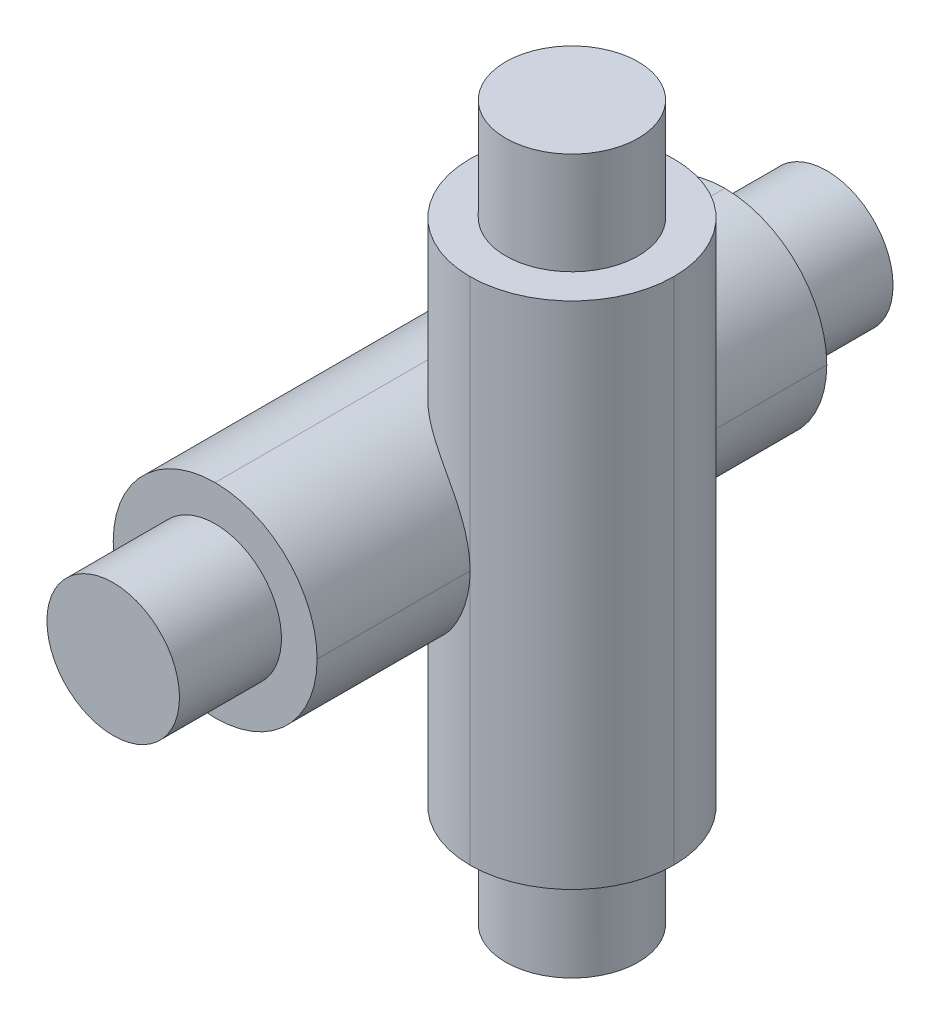
ISO-10303-21;
HEADER;
FILE_DESCRIPTION(('STEP AP214'),'2;1');
FILE_NAME('part.step','',(''),(''),'','','');
FILE_SCHEMA(('AUTOMOTIVE_DESIGN { 1 0 10303 214 1 1 1 1 }'));
ENDSEC;
DATA;
#1=APPLICATION_CONTEXT('core data for automotive mechanical design processes');
#2=APPLICATION_PROTOCOL_DEFINITION('international standard','automotive_design',2000,#1);
#3=PRODUCT_CONTEXT('',#1,'mechanical');
#4=PRODUCT('Part','Part','',(#3));
#5=PRODUCT_RELATED_PRODUCT_CATEGORY('part','',(#4));
#6=PRODUCT_DEFINITION_FORMATION('','',#4);
#7=PRODUCT_DEFINITION_CONTEXT('part definition',#1,'design');
#8=PRODUCT_DEFINITION('design','',#6,#7);
#9=PRODUCT_DEFINITION_SHAPE('','',#8);
#10=(LENGTH_UNIT() NAMED_UNIT(*) SI_UNIT(.MILLI.,.METRE.));
#11=(NAMED_UNIT(*) PLANE_ANGLE_UNIT() SI_UNIT($,.RADIAN.));
#12=(NAMED_UNIT(*) SI_UNIT($,.STERADIAN.) SOLID_ANGLE_UNIT());
#13=UNCERTAINTY_MEASURE_WITH_UNIT(LENGTH_MEASURE(1.E-05),#10,'distance_accuracy_value','');
#14=(GEOMETRIC_REPRESENTATION_CONTEXT(3) GLOBAL_UNCERTAINTY_ASSIGNED_CONTEXT((#13)) GLOBAL_UNIT_ASSIGNED_CONTEXT((#10,
#11,#12)) REPRESENTATION_CONTEXT('',''));
#15=CARTESIAN_POINT('',(0.,0.,0.));
#16=DIRECTION('',(0.,0.,1.));
#17=DIRECTION('',(1.,0.,0.));
#18=AXIS2_PLACEMENT_3D('',#15,#16,#17);
#19=CARTESIAN_POINT('',(0.,0.,25.));
#20=DIRECTION('',(0.,0.,-1.));
#21=DIRECTION('',(-1.,0.,0.));
#22=AXIS2_PLACEMENT_3D('',#19,#20,#21);
#23=PLANE('',#22);
#24=CARTESIAN_POINT('',(0.,0.,25.));
#25=DIRECTION('',(0.,0.,-1.));
#26=DIRECTION('',(-1.,0.,0.));
#27=AXIS2_PLACEMENT_3D('',#24,#25,#26);
#28=CIRCLE('',#27,6.5);
#29=CARTESIAN_POINT('',(-6.5,0.,25.));
#30=VERTEX_POINT('',#29);
#31=EDGE_CURVE('E289',#30,#30,#28,.F.);
#32=ORIENTED_EDGE('',*,*,#31,.F.);
#33=EDGE_LOOP('',(#32));
#34=FACE_BOUND('',#33,.T.);
#35=CARTESIAN_POINT('',(0.,0.,25.));
#36=DIRECTION('',(0.,0.,-1.));
#37=DIRECTION('',(-1.,0.,0.));
#38=AXIS2_PLACEMENT_3D('',#35,#36,#37);
#39=CIRCLE('',#38,10.);
#40=CARTESIAN_POINT('',(0.,-10.,25.));
#41=VERTEX_POINT('',#40);
#42=CARTESIAN_POINT('',(10.,0.,25.));
#43=VERTEX_POINT('',#42);
#44=EDGE_CURVE('E335',#41,#43,#39,.F.);
#45=ORIENTED_EDGE('',*,*,#44,.T.);
#46=CARTESIAN_POINT('',(0.,0.,25.));
#47=DIRECTION('',(0.,0.,-1.));
#48=DIRECTION('',(-1.,0.,0.));
#49=AXIS2_PLACEMENT_3D('',#46,#47,#48);
#50=CIRCLE('',#49,10.);
#51=CARTESIAN_POINT('',(0.,10.,25.));
#52=VERTEX_POINT('',#51);
#53=EDGE_CURVE('E158',#43,#52,#50,.F.);
#54=ORIENTED_EDGE('',*,*,#53,.T.);
#55=CARTESIAN_POINT('',(0.,0.,25.));
#56=DIRECTION('',(0.,0.,-1.));
#57=DIRECTION('',(-1.,0.,0.));
#58=AXIS2_PLACEMENT_3D('',#55,#56,#57);
#59=CIRCLE('',#58,10.);
#60=CARTESIAN_POINT('',(-10.,0.,25.));
#61=VERTEX_POINT('',#60);
#62=EDGE_CURVE('E325',#52,#61,#59,.F.);
#63=ORIENTED_EDGE('',*,*,#62,.T.);
#64=CARTESIAN_POINT('',(0.,0.,25.));
#65=DIRECTION('',(0.,0.,-1.));
#66=DIRECTION('',(-1.,0.,0.));
#67=AXIS2_PLACEMENT_3D('',#64,#65,#66);
#68=CIRCLE('',#67,10.);
#69=EDGE_CURVE('E161',#61,#41,#68,.F.);
#70=ORIENTED_EDGE('',*,*,#69,.T.);
#71=EDGE_LOOP('',(#45,#54,#63,#70));
#72=FACE_BOUND('',#71,.T.);
#73=ADVANCED_FACE('F45',(#34,#72),#23,.F.);
#74=CARTESIAN_POINT('',(0.,0.,-25.));
#75=DIRECTION('',(0.,0.,-1.));
#76=DIRECTION('',(-1.,0.,0.));
#77=AXIS2_PLACEMENT_3D('',#74,#75,#76);
#78=PLANE('',#77);
#79=CARTESIAN_POINT('',(0.,0.,-25.));
#80=DIRECTION('',(0.,0.,-1.));
#81=DIRECTION('',(-1.,0.,0.));
#82=AXIS2_PLACEMENT_3D('',#79,#80,#81);
#83=CIRCLE('',#82,6.5);
#84=CARTESIAN_POINT('',(-6.5,0.,-25.));
#85=VERTEX_POINT('',#84);
#86=EDGE_CURVE('E280',#85,#85,#83,.F.);
#87=ORIENTED_EDGE('',*,*,#86,.T.);
#88=EDGE_LOOP('',(#87));
#89=FACE_BOUND('',#88,.T.);
#90=CARTESIAN_POINT('',(0.,0.,-25.));
#91=DIRECTION('',(0.,0.,-1.));
#92=DIRECTION('',(-1.,0.,0.));
#93=AXIS2_PLACEMENT_3D('',#90,#91,#92);
#94=CIRCLE('',#93,10.);
#95=CARTESIAN_POINT('',(0.,10.,-25.));
#96=VERTEX_POINT('',#95);
#97=CARTESIAN_POINT('',(10.,0.,-25.));
#98=VERTEX_POINT('',#97);
#99=EDGE_CURVE('E329',#96,#98,#94,.T.);
#100=ORIENTED_EDGE('',*,*,#99,.T.);
#101=CARTESIAN_POINT('',(0.,0.,-25.));
#102=DIRECTION('',(0.,0.,-1.));
#103=DIRECTION('',(-1.,0.,0.));
#104=AXIS2_PLACEMENT_3D('',#101,#102,#103);
#105=CIRCLE('',#104,10.);
#106=CARTESIAN_POINT('',(0.,-10.,-25.));
#107=VERTEX_POINT('',#106);
#108=EDGE_CURVE('E154',#98,#107,#105,.T.);
#109=ORIENTED_EDGE('',*,*,#108,.T.);
#110=CARTESIAN_POINT('',(0.,0.,-25.));
#111=DIRECTION('',(0.,0.,-1.));
#112=DIRECTION('',(-1.,0.,0.));
#113=AXIS2_PLACEMENT_3D('',#110,#111,#112);
#114=CIRCLE('',#113,10.);
#115=CARTESIAN_POINT('',(-10.,0.,-25.));
#116=VERTEX_POINT('',#115);
#117=EDGE_CURVE('E155',#107,#116,#114,.T.);
#118=ORIENTED_EDGE('',*,*,#117,.T.);
#119=CARTESIAN_POINT('',(0.,0.,-25.));
#120=DIRECTION('',(0.,0.,-1.));
#121=DIRECTION('',(-1.,0.,0.));
#122=AXIS2_PLACEMENT_3D('',#119,#120,#121);
#123=CIRCLE('',#122,10.);
#124=EDGE_CURVE('E321',#116,#96,#123,.T.);
#125=ORIENTED_EDGE('',*,*,#124,.T.);
#126=EDGE_LOOP('',(#100,#109,#118,#125));
#127=FACE_BOUND('',#126,.T.);
#128=ADVANCED_FACE('F228',(#89,#127),#78,.T.);
#129=CARTESIAN_POINT('',(0.,25.,0.));
#130=DIRECTION('',(0.,-1.,0.));
#131=DIRECTION('',(0.,0.,-1.));
#132=AXIS2_PLACEMENT_3D('',#129,#130,#131);
#133=PLANE('',#132);
#134=CARTESIAN_POINT('',(10.,25.,0.));
#135=DIRECTION('',(0.,-1.,0.));
#136=DIRECTION('',(0.,0.,-1.));
#137=AXIS2_PLACEMENT_3D('',#134,#135,#136);
#138=CIRCLE('',#137,6.5);
#139=CARTESIAN_POINT('',(10.,25.,-6.5));
#140=VERTEX_POINT('',#139);
#141=EDGE_CURVE('E293',#140,#140,#138,.F.);
#142=ORIENTED_EDGE('',*,*,#141,.F.);
#143=EDGE_LOOP('',(#142));
#144=FACE_BOUND('',#143,.T.);
#145=CARTESIAN_POINT('',(10.,25.,0.));
#146=DIRECTION('',(0.,-1.,0.));
#147=DIRECTION('',(0.,0.,-1.));
#148=AXIS2_PLACEMENT_3D('',#145,#146,#147);
#149=CIRCLE('',#148,10.);
#150=CARTESIAN_POINT('',(20.,25.,0.));
#151=VERTEX_POINT('',#150);
#152=CARTESIAN_POINT('',(10.,25.,-10.));
#153=VERTEX_POINT('',#152);
#154=EDGE_CURVE('E144',#151,#153,#149,.F.);
#155=ORIENTED_EDGE('',*,*,#154,.T.);
#156=CARTESIAN_POINT('',(10.,25.,0.));
#157=DIRECTION('',(0.,-1.,0.));
#158=DIRECTION('',(0.,0.,-1.));
#159=AXIS2_PLACEMENT_3D('',#156,#157,#158);
#160=CIRCLE('',#159,10.);
#161=CARTESIAN_POINT('',(0.,25.,0.));
#162=VERTEX_POINT('',#161);
#163=EDGE_CURVE('E347',#153,#162,#160,.F.);
#164=ORIENTED_EDGE('',*,*,#163,.T.);
#165=CARTESIAN_POINT('',(10.,25.,0.));
#166=DIRECTION('',(0.,-1.,0.));
#167=DIRECTION('',(0.,0.,-1.));
#168=AXIS2_PLACEMENT_3D('',#165,#166,#167);
#169=CIRCLE('',#168,10.);
#170=CARTESIAN_POINT('',(10.,25.,10.));
#171=VERTEX_POINT('',#170);
#172=EDGE_CURVE('E96',#162,#171,#169,.F.);
#173=ORIENTED_EDGE('',*,*,#172,.T.);
#174=CARTESIAN_POINT('',(10.,25.,0.));
#175=DIRECTION('',(0.,-1.,0.));
#176=DIRECTION('',(0.,0.,-1.));
#177=AXIS2_PLACEMENT_3D('',#174,#175,#176);
#178=CIRCLE('',#177,10.);
#179=EDGE_CURVE('E141',#171,#151,#178,.F.);
#180=ORIENTED_EDGE('',*,*,#179,.T.);
#181=EDGE_LOOP('',(#155,#164,#173,#180));
#182=FACE_BOUND('',#181,.T.);
#183=ADVANCED_FACE('F235',(#144,#182),#133,.F.);
#184=CARTESIAN_POINT('',(0.,-25.,0.));
#185=DIRECTION('',(0.,-1.,0.));
#186=DIRECTION('',(0.,0.,-1.));
#187=AXIS2_PLACEMENT_3D('',#184,#185,#186);
#188=PLANE('',#187);
#189=CARTESIAN_POINT('',(10.,-25.,0.));
#190=DIRECTION('',(0.,-1.,0.));
#191=DIRECTION('',(0.,0.,-1.));
#192=AXIS2_PLACEMENT_3D('',#189,#190,#191);
#193=CIRCLE('',#192,6.5);
#194=CARTESIAN_POINT('',(10.,-25.,-6.5));
#195=VERTEX_POINT('',#194);
#196=EDGE_CURVE('E297',#195,#195,#193,.F.);
#197=ORIENTED_EDGE('',*,*,#196,.T.);
#198=EDGE_LOOP('',(#197));
#199=FACE_BOUND('',#198,.T.);
#200=CARTESIAN_POINT('',(10.,-25.,0.));
#201=DIRECTION('',(0.,-1.,0.));
#202=DIRECTION('',(0.,0.,-1.));
#203=AXIS2_PLACEMENT_3D('',#200,#201,#202);
#204=CIRCLE('',#203,10.);
#205=CARTESIAN_POINT('',(10.,-25.,10.));
#206=VERTEX_POINT('',#205);
#207=CARTESIAN_POINT('',(0.,-25.,0.));
#208=VERTEX_POINT('',#207);
#209=EDGE_CURVE('E70',#206,#208,#204,.T.);
#210=ORIENTED_EDGE('',*,*,#209,.T.);
#211=CARTESIAN_POINT('',(10.,-25.,0.));
#212=DIRECTION('',(0.,-1.,0.));
#213=DIRECTION('',(0.,0.,-1.));
#214=AXIS2_PLACEMENT_3D('',#211,#212,#213);
#215=CIRCLE('',#214,10.);
#216=CARTESIAN_POINT('',(10.,-25.,-10.));
#217=VERTEX_POINT('',#216);
#218=EDGE_CURVE('E207',#208,#217,#215,.T.);
#219=ORIENTED_EDGE('',*,*,#218,.T.);
#220=CARTESIAN_POINT('',(10.,-25.,0.));
#221=DIRECTION('',(0.,-1.,0.));
#222=DIRECTION('',(0.,0.,-1.));
#223=AXIS2_PLACEMENT_3D('',#220,#221,#222);
#224=CIRCLE('',#223,10.);
#225=CARTESIAN_POINT('',(20.,-25.,0.));
#226=VERTEX_POINT('',#225);
#227=EDGE_CURVE('E309',#217,#226,#224,.T.);
#228=ORIENTED_EDGE('',*,*,#227,.T.);
#229=CARTESIAN_POINT('',(10.,-25.,0.));
#230=DIRECTION('',(0.,-1.,0.));
#231=DIRECTION('',(0.,0.,-1.));
#232=AXIS2_PLACEMENT_3D('',#229,#230,#231);
#233=CIRCLE('',#232,10.);
#234=EDGE_CURVE('E164',#226,#206,#233,.T.);
#235=ORIENTED_EDGE('',*,*,#234,.T.);
#236=EDGE_LOOP('',(#210,#219,#228,#235));
#237=FACE_BOUND('',#236,.T.);
#238=ADVANCED_FACE('F240',(#199,#237),#188,.T.);
#239=CARTESIAN_POINT('',(10.,-35.,0.));
#240=DIRECTION('',(0.,1.,0.));
#241=DIRECTION('',(0.,0.,1.));
#242=AXIS2_PLACEMENT_3D('',#239,#240,#241);
#243=PLANE('',#242);
#244=CARTESIAN_POINT('',(10.,-35.,0.));
#245=DIRECTION('',(0.,1.,0.));
#246=DIRECTION('',(0.,0.,1.));
#247=AXIS2_PLACEMENT_3D('',#244,#245,#246);
#248=CIRCLE('',#247,6.5);
#249=CARTESIAN_POINT('',(10.,-35.,6.5));
#250=VERTEX_POINT('',#249);
#251=EDGE_CURVE('E284',#250,#250,#248,.T.);
#252=ORIENTED_EDGE('',*,*,#251,.F.);
#253=EDGE_LOOP('',(#252));
#254=FACE_BOUND('',#253,.T.);
#255=ADVANCED_FACE('F243',(#254),#243,.F.);
#256=CARTESIAN_POINT('',(10.,35.,0.));
#257=DIRECTION('',(0.,-1.,0.));
#258=DIRECTION('',(0.,0.,-1.));
#259=AXIS2_PLACEMENT_3D('',#256,#257,#258);
#260=CYLINDRICAL_SURFACE('',#259,6.5);
#261=ORIENTED_EDGE('',*,*,#196,.F.);
#262=EDGE_LOOP('',(#261));
#263=FACE_BOUND('',#262,.T.);
#264=ORIENTED_EDGE('',*,*,#251,.T.);
#265=EDGE_LOOP('',(#264));
#266=FACE_BOUND('',#265,.T.);
#267=ADVANCED_FACE('F248',(#263,#266),#260,.T.);
#268=CARTESIAN_POINT('',(10.,35.,0.));
#269=DIRECTION('',(0.,1.,0.));
#270=DIRECTION('',(0.,0.,1.));
#271=AXIS2_PLACEMENT_3D('',#268,#269,#270);
#272=CIRCLE('',#271,6.5);
#273=CARTESIAN_POINT('',(10.,35.,6.5));
#274=VERTEX_POINT('',#273);
#275=EDGE_CURVE('E294',#274,#274,#272,.T.);
#276=ORIENTED_EDGE('',*,*,#275,.F.);
#277=EDGE_LOOP('',(#276));
#278=FACE_BOUND('',#277,.T.);
#279=ORIENTED_EDGE('',*,*,#141,.T.);
#280=EDGE_LOOP('',(#279));
#281=FACE_BOUND('',#280,.T.);
#282=ADVANCED_FACE('F251',(#278,#281),#260,.T.);
#283=CARTESIAN_POINT('',(10.,35.,0.));
#284=DIRECTION('',(0.,1.,0.));
#285=DIRECTION('',(0.,0.,1.));
#286=AXIS2_PLACEMENT_3D('',#283,#284,#285);
#287=PLANE('',#286);
#288=ORIENTED_EDGE('',*,*,#275,.T.);
#289=EDGE_LOOP('',(#288));
#290=FACE_BOUND('',#289,.T.);
#291=ADVANCED_FACE('F256',(#290),#287,.T.);
#292=CARTESIAN_POINT('',(0.,0.,-35.));
#293=DIRECTION('',(0.,0.,1.));
#294=DIRECTION('',(1.,0.,0.));
#295=AXIS2_PLACEMENT_3D('',#292,#293,#294);
#296=PLANE('',#295);
#297=CARTESIAN_POINT('',(0.,0.,-35.));
#298=DIRECTION('',(0.,0.,1.));
#299=DIRECTION('',(1.,0.,0.));
#300=AXIS2_PLACEMENT_3D('',#297,#298,#299);
#301=CIRCLE('',#300,6.5);
#302=CARTESIAN_POINT('',(6.5,0.,-35.));
#303=VERTEX_POINT('',#302);
#304=EDGE_CURVE('E281',#303,#303,#301,.T.);
#305=ORIENTED_EDGE('',*,*,#304,.F.);
#306=EDGE_LOOP('',(#305));
#307=FACE_BOUND('',#306,.T.);
#308=ADVANCED_FACE('F259',(#307),#296,.F.);
#309=CARTESIAN_POINT('',(0.,0.,35.));
#310=DIRECTION('',(0.,0.,-1.));
#311=DIRECTION('',(-1.,0.,0.));
#312=AXIS2_PLACEMENT_3D('',#309,#310,#311);
#313=CYLINDRICAL_SURFACE('',#312,6.5);
#314=ORIENTED_EDGE('',*,*,#86,.F.);
#315=EDGE_LOOP('',(#314));
#316=FACE_BOUND('',#315,.T.);
#317=ORIENTED_EDGE('',*,*,#304,.T.);
#318=EDGE_LOOP('',(#317));
#319=FACE_BOUND('',#318,.T.);
#320=ADVANCED_FACE('F261',(#316,#319),#313,.T.);
#321=CARTESIAN_POINT('',(0.,0.,35.));
#322=DIRECTION('',(0.,0.,1.));
#323=DIRECTION('',(1.,0.,0.));
#324=AXIS2_PLACEMENT_3D('',#321,#322,#323);
#325=CIRCLE('',#324,6.5);
#326=CARTESIAN_POINT('',(6.5,0.,35.));
#327=VERTEX_POINT('',#326);
#328=EDGE_CURVE('E279',#327,#327,#325,.T.);
#329=ORIENTED_EDGE('',*,*,#328,.F.);
#330=EDGE_LOOP('',(#329));
#331=FACE_BOUND('',#330,.T.);
#332=ORIENTED_EDGE('',*,*,#31,.T.);
#333=EDGE_LOOP('',(#332));
#334=FACE_BOUND('',#333,.T.);
#335=ADVANCED_FACE('F264',(#331,#334),#313,.T.);
#336=CARTESIAN_POINT('',(0.,0.,35.));
#337=DIRECTION('',(0.,0.,1.));
#338=DIRECTION('',(1.,0.,0.));
#339=AXIS2_PLACEMENT_3D('',#336,#337,#338);
#340=PLANE('',#339);
#341=ORIENTED_EDGE('',*,*,#328,.T.);
#342=EDGE_LOOP('',(#341));
#343=FACE_BOUND('',#342,.T.);
#344=ADVANCED_FACE('F269',(#343),#340,.T.);
#345=CARTESIAN_POINT('',(10.,25.,0.));
#346=DIRECTION('',(0.,-1.,0.));
#347=DIRECTION('',(0.,0.,-1.));
#348=AXIS2_PLACEMENT_3D('',#345,#346,#347);
#349=CYLINDRICAL_SURFACE('',#348,10.);
#350=ORIENTED_EDGE('',*,*,#154,.F.);
#351=DIRECTION('',(0.,-1.,0.));
#352=VECTOR('',#351,1.);
#353=CARTESIAN_POINT('',(20.,25.,0.));
#354=LINE('',#353,#352);
#355=EDGE_CURVE('E312',#226,#151,#354,.F.);
#356=ORIENTED_EDGE('',*,*,#355,.F.);
#357=ORIENTED_EDGE('',*,*,#227,.F.);
#358=DIRECTION('',(0.,-1.,0.));
#359=VECTOR('',#358,1.);
#360=CARTESIAN_POINT('',(10.,25.,-10.));
#361=LINE('',#360,#359);
#362=CARTESIAN_POINT('',(10.,0.,-10.));
#363=VERTEX_POINT('',#362);
#364=EDGE_CURVE('E292',#363,#217,#361,.T.);
#365=ORIENTED_EDGE('',*,*,#364,.F.);
#366=DIRECTION('',(0.,-1.,0.));
#367=VECTOR('',#366,1.);
#368=CARTESIAN_POINT('',(10.,25.,-10.));
#369=LINE('',#368,#367);
#370=EDGE_CURVE('E306',#153,#363,#369,.T.);
#371=ORIENTED_EDGE('',*,*,#370,.F.);
#372=EDGE_LOOP('',(#350,#356,#357,#365,#371));
#373=FACE_BOUND('',#372,.T.);
#374=ADVANCED_FACE('F188',(#373),#349,.T.);
#375=CARTESIAN_POINT('',(10.,25.,0.));
#376=DIRECTION('',(0.,-1.,0.));
#377=DIRECTION('',(0.,0.,-1.));
#378=AXIS2_PLACEMENT_3D('',#375,#376,#377);
#379=CYLINDRICAL_SURFACE('',#378,10.);
#380=ORIENTED_EDGE('',*,*,#172,.F.);
#381=DIRECTION('',(0.,-1.,0.));
#382=VECTOR('',#381,1.);
#383=CARTESIAN_POINT('',(0.,25.,0.));
#384=LINE('',#383,#382);
#385=CARTESIAN_POINT('',(0.,10.,0.));
#386=VERTEX_POINT('',#385);
#387=EDGE_CURVE('E143',#386,#162,#384,.F.);
#388=ORIENTED_EDGE('',*,*,#387,.F.);
#389=CARTESIAN_POINT('',(0.,10.,0.));
#390=CARTESIAN_POINT('',(1.23690674507108E-07,9.99999597690382,0.139199671074268));
#391=CARTESIAN_POINT('',(0.00290692756560856,10.0000005168009,0.278382771741548));
#392=CARTESIAN_POINT('',(0.0145265178405306,9.99999188506233,0.556502783875044));
#393=CARTESIAN_POINT('',(0.0232391538368423,9.9999787138854,0.695439701625296));
#394=CARTESIAN_POINT('',(0.0580700679563408,9.9998603985296,1.11151389136903));
#395=CARTESIAN_POINT('',(0.0928813589442078,9.9996764802343,1.38797353886429));
#396=CARTESIAN_POINT('',(0.185521080853665,9.99838572681989,1.93747229664165));
#397=CARTESIAN_POINT('',(0.24338988564381,9.99727726908359,2.21050453587934));
#398=CARTESIAN_POINT('',(0.381736305009191,9.99295077529482,2.75077200068285));
#399=CARTESIAN_POINT('',(0.462213627054219,9.98973276653698,3.01800730120672));
#400=CARTESIAN_POINT('',(0.645297472444796,9.97957916857013,3.54506082635295));
#401=CARTESIAN_POINT('',(0.747929061397734,9.97263935515399,3.80487026908912));
#402=CARTESIAN_POINT('',(0.974469488082673,9.95305619758356,4.31481477513236));
#403=CARTESIAN_POINT('',(1.09837699592611,9.94041320983585,4.56495044191911));
#404=CARTESIAN_POINT('',(1.36631933618827,9.90713757137151,5.05342391804415));
#405=CARTESIAN_POINT('',(1.5103392219611,9.88651083384638,5.29177031214314));
#406=CARTESIAN_POINT('',(1.81716772333794,9.83473906411298,5.75485701676864));
#407=CARTESIAN_POINT('',(1.97997513307107,9.80359470672769,5.979598199131));
#408=CARTESIAN_POINT('',(2.31584335455438,9.72960757226455,6.40502124734512));
#409=CARTESIAN_POINT('',(2.48825881305286,9.6872670742935,6.60629897846497));
#410=CARTESIAN_POINT('',(2.8465604029735,9.58809813467362,6.99268894617005));
#411=CARTESIAN_POINT('',(3.03244622577741,9.53127002487405,7.17780155289881));
#412=CARTESIAN_POINT('',(3.41472048398578,9.40108433276474,7.53004362997336));
#413=CARTESIAN_POINT('',(3.61109529131611,9.32774781926028,7.69719562428202));
#414=CARTESIAN_POINT('',(4.01127237052482,9.16277708596774,8.01248985046981));
#415=CARTESIAN_POINT('',(4.21507334468445,9.0711460507207,8.16063538345595));
#416=CARTESIAN_POINT('',(4.59832733904435,8.88226414881602,8.41830068193381));
#417=CARTESIAN_POINT('',(4.7773142453048,8.78748017424316,8.53033301699849));
#418=CARTESIAN_POINT('',(5.13548766613369,8.58307992812166,8.73953770417555));
#419=CARTESIAN_POINT('',(5.31467415857254,8.47346516462406,8.83671156501688));
#420=CARTESIAN_POINT('',(5.67069490323291,8.2394539872263,9.01647943966891));
#421=CARTESIAN_POINT('',(5.84752903598304,8.11505682572223,9.09907271555667));
#422=CARTESIAN_POINT('',(6.19639487632782,7.85190584084755,9.25033744645292));
#423=CARTESIAN_POINT('',(6.36842655578036,7.71315193336958,9.31900881989458));
#424=CARTESIAN_POINT('',(6.69567332097598,7.43047575695441,9.43981300800538));
#425=CARTESIAN_POINT('',(6.85128488575252,7.2873211618252,9.49267450810663));
#426=CARTESIAN_POINT('',(7.15465871115997,6.98970737916274,9.58797767775067));
#427=CARTESIAN_POINT('',(7.30242138635322,6.8352487897101,9.63041989804828));
#428=CARTESIAN_POINT('',(7.58875417946748,6.51588937411622,9.70607184431797));
#429=CARTESIAN_POINT('',(7.72732327684213,6.35098739264914,9.73928054661129));
#430=CARTESIAN_POINT('',(7.99414061042715,6.01168113983192,9.79771330454865));
#431=CARTESIAN_POINT('',(8.12238762208248,5.83727574515335,9.82293641386442));
#432=CARTESIAN_POINT('',(8.37975889693831,5.46226485089047,9.86881754430685));
#433=CARTESIAN_POINT('',(8.50771731074003,5.26077344711928,9.88877806858284));
#434=CARTESIAN_POINT('',(8.74909334646161,4.84875106905079,9.92220151931952));
#435=CARTESIAN_POINT('',(8.86251013786373,4.63821957936163,9.9356640747821));
#436=CARTESIAN_POINT('',(9.074128052636,4.20921001643262,9.95761464077511));
#437=CARTESIAN_POINT('',(9.17231807955366,3.99072628985848,9.9660990359053));
#438=CARTESIAN_POINT('',(9.35279839540826,3.54718188084143,9.97944479204875));
#439=CARTESIAN_POINT('',(9.43508802620443,3.32212092660109,9.98430600311687));
#440=CARTESIAN_POINT('',(9.59032858462394,2.84505307220381,9.99193586595226));
#441=CARTESIAN_POINT('',(9.661657130275,2.59251277419828,9.99446275343609));
#442=CARTESIAN_POINT('',(9.78425278477425,2.08259017430602,9.99786037804838));
#443=CARTESIAN_POINT('',(9.83551810710669,1.82520744336592,9.99873096771958));
#444=CARTESIAN_POINT('',(9.91764367613964,1.30729947631086,9.99974574636641));
#445=CARTESIAN_POINT('',(9.94851354902254,1.04677578186478,9.99989027823759));
#446=CARTESIAN_POINT('',(9.97939731417542,0.654843579827126,9.99998326249741));
#447=CARTESIAN_POINT('',(9.98712172924611,0.524000614482664,9.99999361860368));
#448=CARTESIAN_POINT('',(9.99742306195345,0.262109739340867,10.0000004098042));
#449=CARTESIAN_POINT('',(9.99999988298127,0.131061825743304,9.99999684463727));
#450=CARTESIAN_POINT('',(10.,0.,10.));
#451=B_SPLINE_CURVE_WITH_KNOTS('',3,(#389,#390,#391,#392,#393,#394,#395,#396,#397,#398,#399,
#400,#401,#402,#403,#404,#405,#406,#407,#408,#409,#410,#411,#412,#413,#414,#415,#416,#417,#418,
#419,#420,#421,#422,#423,#424,#425,#426,#427,#428,#429,#430,#431,#432,#433,#434,#435,#436,#437,
#438,#439,#440,#441,#442,#443,#444,#445,#446,#447,#448,#449,#450),.UNSPECIFIED.,.F.,.F.,(4,2,2,
2,2,2,2,2,2,2,2,2,2,2,2,2,2,2,2,2,2,2,2,2,2,2,2,2,2,2,4),(0.,0.41753557824488,0.835060340392538,
1.66993360478835,2.50627520808202,3.34260599050173,4.17988801424367,5.0171177212457,
5.85372851414607,6.6902856393008,7.49429579747,8.29828754085775,9.10125895165531,
9.90409071029263,10.5975328155408,11.290904461876,11.9843111896735,12.6777219799447,
13.3308777593294,13.9839990059837,14.6371926324185,15.2904636362537,16.0082950721287,
16.7261674873668,17.4445606158141,18.1629834732423,18.9494417237357,19.7359699879314,
20.5221267632061,20.9152517479719,21.3083841107458),.UNSPECIFIED.);
#452=CARTESIAN_POINT('',(10.,0.,10.));
#453=VERTEX_POINT('',#452);
#454=EDGE_CURVE('E148',#386,#453,#451,.T.);
#455=ORIENTED_EDGE('',*,*,#454,.T.);
#456=DIRECTION('',(0.,-1.,0.));
#457=VECTOR('',#456,1.);
#458=CARTESIAN_POINT('',(10.,25.,10.));
#459=LINE('',#458,#457);
#460=EDGE_CURVE('E135',#171,#453,#459,.T.);
#461=ORIENTED_EDGE('',*,*,#460,.F.);
#462=EDGE_LOOP('',(#380,#388,#455,#461));
#463=FACE_BOUND('',#462,.T.);
#464=ADVANCED_FACE('F149',(#463),#379,.T.);
#465=CARTESIAN_POINT('',(0.,0.,25.));
#466=DIRECTION('',(0.,0.,-1.));
#467=DIRECTION('',(-1.,0.,0.));
#468=AXIS2_PLACEMENT_3D('',#465,#466,#467);
#469=CYLINDRICAL_SURFACE('',#468,10.);
#470=DIRECTION('',(0.,0.,-1.));
#471=VECTOR('',#470,1.);
#472=CARTESIAN_POINT('',(0.,10.,25.));
#473=LINE('',#472,#471);
#474=EDGE_CURVE('E327',#386,#52,#473,.F.);
#475=ORIENTED_EDGE('',*,*,#474,.F.);
#476=DIRECTION('',(0.,0.,-1.));
#477=VECTOR('',#476,1.);
#478=CARTESIAN_POINT('',(0.,10.,25.));
#479=LINE('',#478,#477);
#480=EDGE_CURVE('E84',#96,#386,#479,.F.);
#481=ORIENTED_EDGE('',*,*,#480,.F.);
#482=ORIENTED_EDGE('',*,*,#124,.F.);
#483=DIRECTION('',(0.,0.,-1.));
#484=VECTOR('',#483,1.);
#485=CARTESIAN_POINT('',(-10.,0.,25.));
#486=LINE('',#485,#484);
#487=EDGE_CURVE('E318',#61,#116,#486,.T.);
#488=ORIENTED_EDGE('',*,*,#487,.F.);
#489=ORIENTED_EDGE('',*,*,#62,.F.);
#490=EDGE_LOOP('',(#475,#481,#482,#488,#489));
#491=FACE_BOUND('',#490,.T.);
#492=ADVANCED_FACE('F187',(#491),#469,.T.);
#493=CARTESIAN_POINT('',(0.,0.,25.));
#494=DIRECTION('',(0.,0.,-1.));
#495=DIRECTION('',(-1.,0.,0.));
#496=AXIS2_PLACEMENT_3D('',#493,#494,#495);
#497=CYLINDRICAL_SURFACE('',#496,10.);
#498=ORIENTED_EDGE('',*,*,#480,.T.);
#499=CARTESIAN_POINT('',(0.,10.,0.));
#500=CARTESIAN_POINT('',(1.23690675412977E-07,9.99999597690382,-0.139199671074266));
#501=CARTESIAN_POINT('',(0.00290692756560922,10.0000005168009,-0.278382771741546));
#502=CARTESIAN_POINT('',(0.0145265178405302,9.99999188506233,-0.556502783875041));
#503=CARTESIAN_POINT('',(0.0232391538368411,9.9999787138854,-0.695439701625294));
#504=CARTESIAN_POINT('',(0.0580700679563388,9.9998603985296,-1.11151389136903));
#505=CARTESIAN_POINT('',(0.0928813589442076,9.9996764802343,-1.38797353886428));
#506=CARTESIAN_POINT('',(0.185521080853667,9.99838572681989,-1.93747229664164));
#507=CARTESIAN_POINT('',(0.243389885643812,9.99727726908359,-2.21050453587933));
#508=CARTESIAN_POINT('',(0.38173630500919,9.99295077529482,-2.75077200068285));
#509=CARTESIAN_POINT('',(0.462213627054216,9.98973276653698,-3.01800730120671));
#510=CARTESIAN_POINT('',(0.645297472444793,9.97957916857013,-3.54506082635294));
#511=CARTESIAN_POINT('',(0.747929061397733,9.97263935515399,-3.80487026908911));
#512=CARTESIAN_POINT('',(0.974469488082673,9.95305619758356,-4.31481477513236));
#513=CARTESIAN_POINT('',(1.09837699592611,9.94041320983585,-4.56495044191911));
#514=CARTESIAN_POINT('',(1.36631933618826,9.90713757137152,-5.05342391804415));
#515=CARTESIAN_POINT('',(1.51033922196109,9.88651083384638,-5.29177031214313));
#516=CARTESIAN_POINT('',(1.81716772333794,9.83473906411298,-5.75485701676864));
#517=CARTESIAN_POINT('',(1.97997513307107,9.80359470672769,-5.97959819913099));
#518=CARTESIAN_POINT('',(2.31584335455438,9.72960757226455,-6.40502124734511));
#519=CARTESIAN_POINT('',(2.48825881305285,9.6872670742935,-6.60629897846496));
#520=CARTESIAN_POINT('',(2.8465604029735,9.58809813467362,-6.99268894617004));
#521=CARTESIAN_POINT('',(3.03244622577741,9.53127002487405,-7.17780155289881));
#522=CARTESIAN_POINT('',(3.41472048398578,9.40108433276474,-7.53004362997336));
#523=CARTESIAN_POINT('',(3.61109529131611,9.32774781926029,-7.69719562428202));
#524=CARTESIAN_POINT('',(4.01127237052482,9.16277708596774,-8.0124898504698));
#525=CARTESIAN_POINT('',(4.21507334468445,9.0711460507207,-8.16063538345595));
#526=CARTESIAN_POINT('',(4.59832733904434,8.88226414881602,-8.41830068193381));
#527=CARTESIAN_POINT('',(4.7773142453048,8.78748017424317,-8.53033301699849));
#528=CARTESIAN_POINT('',(5.13548766613368,8.58307992812166,-8.73953770417554));
#529=CARTESIAN_POINT('',(5.31467415857253,8.47346516462406,-8.83671156501688));
#530=CARTESIAN_POINT('',(5.6706949032329,8.2394539872263,-9.0164794396689));
#531=CARTESIAN_POINT('',(5.84752903598303,8.11505682572224,-9.09907271555666));
#532=CARTESIAN_POINT('',(6.19639487632782,7.85190584084755,-9.25033744645292));
#533=CARTESIAN_POINT('',(6.36842655578035,7.71315193336959,-9.31900881989457));
#534=CARTESIAN_POINT('',(6.69567332097597,7.43047575695441,-9.43981300800538));
#535=CARTESIAN_POINT('',(6.85128488575252,7.2873211618252,-9.49267450810662));
#536=CARTESIAN_POINT('',(7.15465871115997,6.98970737916274,-9.58797767775067));
#537=CARTESIAN_POINT('',(7.30242138635322,6.8352487897101,-9.63041989804828));
#538=CARTESIAN_POINT('',(7.58875417946748,6.51588937411622,-9.70607184431796));
#539=CARTESIAN_POINT('',(7.72732327684213,6.35098739264914,-9.73928054661128));
#540=CARTESIAN_POINT('',(7.99414061042715,6.01168113983193,-9.79771330454864));
#541=CARTESIAN_POINT('',(8.12238762208247,5.83727574515335,-9.82293641386442));
#542=CARTESIAN_POINT('',(8.37975889693831,5.46226485089047,-9.86881754430685));
#543=CARTESIAN_POINT('',(8.50771731074003,5.26077344711929,-9.88877806858283));
#544=CARTESIAN_POINT('',(8.7490933464616,4.84875106905079,-9.92220151931952));
#545=CARTESIAN_POINT('',(8.86251013786373,4.63821957936164,-9.9356640747821));
#546=CARTESIAN_POINT('',(9.074128052636,4.20921001643263,-9.9576146407751));
#547=CARTESIAN_POINT('',(9.17231807955365,3.99072628985848,-9.9660990359053));
#548=CARTESIAN_POINT('',(9.35279839540826,3.54718188084143,-9.97944479204874));
#549=CARTESIAN_POINT('',(9.43508802620443,3.3221209266011,-9.98430600311686));
#550=CARTESIAN_POINT('',(9.59032858462394,2.84505307220382,-9.99193586595226));
#551=CARTESIAN_POINT('',(9.661657130275,2.59251277419828,-9.99446275343609));
#552=CARTESIAN_POINT('',(9.78425278477425,2.08259017430602,-9.99786037804837));
#553=CARTESIAN_POINT('',(9.83551810710669,1.82520744336593,-9.99873096771958));
#554=CARTESIAN_POINT('',(9.91764367613964,1.30729947631086,-9.9997457463664));
#555=CARTESIAN_POINT('',(9.94851354902254,1.04677578186478,-9.99989027823759));
#556=CARTESIAN_POINT('',(9.97939731417542,0.654843579827126,-9.9999832624974));
#557=CARTESIAN_POINT('',(9.98712172924611,0.524000614482665,-9.99999361860367));
#558=CARTESIAN_POINT('',(9.99742306195345,0.262109739340868,-10.0000004098042));
#559=CARTESIAN_POINT('',(9.99999988298127,0.131061825743304,-9.99999684463727));
#560=CARTESIAN_POINT('',(10.,0.,-10.));
#561=B_SPLINE_CURVE_WITH_KNOTS('',3,(#499,#500,#501,#502,#503,#504,#505,#506,#507,#508,#509,
#510,#511,#512,#513,#514,#515,#516,#517,#518,#519,#520,#521,#522,#523,#524,#525,#526,#527,#528,
#529,#530,#531,#532,#533,#534,#535,#536,#537,#538,#539,#540,#541,#542,#543,#544,#545,#546,#547,
#548,#549,#550,#551,#552,#553,#554,#555,#556,#557,#558,#559,#560),.UNSPECIFIED.,.F.,.F.,(4,2,2,
2,2,2,2,2,2,2,2,2,2,2,2,2,2,2,2,2,2,2,2,2,2,2,2,2,2,2,4),(0.,0.417535578244879,
0.835060340392537,1.66993360478835,2.50627520808202,3.34260599050173,4.17988801424367,
5.01711772124569,5.85372851414607,6.69028563930079,7.49429579747,8.29828754085774,
9.1012589516553,9.90409071029263,10.5975328155407,11.290904461876,11.9843111896735,
12.6777219799447,13.3308777593293,13.9839990059837,14.6371926324185,15.2904636362537,
16.0082950721287,16.7261674873668,17.4445606158141,18.1629834732423,18.9494417237357,
19.7359699879314,20.5221267632061,20.9152517479719,21.3083841107458),.UNSPECIFIED.);
#562=EDGE_CURVE('E199',#386,#363,#561,.T.);
#563=ORIENTED_EDGE('',*,*,#562,.T.);
#564=DIRECTION('',(0.,0.,-1.));
#565=VECTOR('',#564,1.);
#566=CARTESIAN_POINT('',(10.,0.,25.));
#567=LINE('',#566,#565);
#568=EDGE_CURVE('E159',#98,#363,#567,.F.);
#569=ORIENTED_EDGE('',*,*,#568,.F.);
#570=ORIENTED_EDGE('',*,*,#99,.F.);
#571=EDGE_LOOP('',(#498,#563,#569,#570));
#572=FACE_BOUND('',#571,.T.);
#573=ADVANCED_FACE('F192',(#572),#497,.T.);
#574=CARTESIAN_POINT('',(0.,0.,25.));
#575=DIRECTION('',(0.,0.,-1.));
#576=DIRECTION('',(-1.,0.,0.));
#577=AXIS2_PLACEMENT_3D('',#574,#575,#576);
#578=CYLINDRICAL_SURFACE('',#577,10.);
#579=ORIENTED_EDGE('',*,*,#44,.F.);
#580=DIRECTION('',(0.,0.,-1.));
#581=VECTOR('',#580,1.);
#582=CARTESIAN_POINT('',(0.,-10.,25.));
#583=LINE('',#582,#581);
#584=CARTESIAN_POINT('',(0.,-10.,0.));
#585=VERTEX_POINT('',#584);
#586=EDGE_CURVE('E61',#585,#41,#583,.F.);
#587=ORIENTED_EDGE('',*,*,#586,.F.);
#588=CARTESIAN_POINT('',(0.,-10.,0.));
#589=CARTESIAN_POINT('',(1.23690675820521E-07,-9.99999597690382,0.139199671074266));
#590=CARTESIAN_POINT('',(0.00290692756560929,-10.0000005168009,0.278382771741546));
#591=CARTESIAN_POINT('',(0.0145265178405294,-9.99999188506233,0.556502783875042));
#592=CARTESIAN_POINT('',(0.0232391538368398,-9.9999787138854,0.695439701625294));
#593=CARTESIAN_POINT('',(0.0580700679563376,-9.9998603985296,1.11151389136903));
#594=CARTESIAN_POINT('',(0.0928813589442088,-9.99967648023431,1.38797353886429));
#595=CARTESIAN_POINT('',(0.185521080853667,-9.9983857268199,1.93747229664164));
#596=CARTESIAN_POINT('',(0.243389885643809,-9.9972772690836,2.21050453587933));
#597=CARTESIAN_POINT('',(0.381736305009187,-9.99295077529482,2.75077200068285));
#598=CARTESIAN_POINT('',(0.462213627054216,-9.98973276653698,3.01800730120671));
#599=CARTESIAN_POINT('',(0.645297472444794,-9.97957916857013,3.54506082635294));
#600=CARTESIAN_POINT('',(0.747929061397731,-9.97263935515399,3.80487026908912));
#601=CARTESIAN_POINT('',(0.974469488082671,-9.95305619758357,4.31481477513236));
#602=CARTESIAN_POINT('',(1.09837699592611,-9.94041320983586,4.56495044191911));
#603=CARTESIAN_POINT('',(1.36631933618827,-9.90713757137152,5.05342391804415));
#604=CARTESIAN_POINT('',(1.5103392219611,-9.88651083384638,5.29177031214314));
#605=CARTESIAN_POINT('',(1.81716772333794,-9.83473906411299,5.75485701676864));
#606=CARTESIAN_POINT('',(1.97997513307107,-9.80359470672769,5.979598199131));
#607=CARTESIAN_POINT('',(2.31584335455438,-9.72960757226456,6.40502124734512));
#608=CARTESIAN_POINT('',(2.48825881305285,-9.68726707429351,6.60629897846496));
#609=CARTESIAN_POINT('',(2.8465604029735,-9.58809813467363,6.99268894617005));
#610=CARTESIAN_POINT('',(3.03244622577741,-9.53127002487405,7.17780155289881));
#611=CARTESIAN_POINT('',(3.41472048398578,-9.40108433276474,7.53004362997336));
#612=CARTESIAN_POINT('',(3.61109529131611,-9.32774781926029,7.69719562428202));
#613=CARTESIAN_POINT('',(4.01127237052482,-9.16277708596775,8.0124898504698));
#614=CARTESIAN_POINT('',(4.21507334468445,-9.0711460507207,8.16063538345595));
#615=CARTESIAN_POINT('',(4.59832733904434,-8.88226414881603,8.41830068193381));
#616=CARTESIAN_POINT('',(4.7773142453048,-8.78748017424317,8.53033301699849));
#617=CARTESIAN_POINT('',(5.13548766613368,-8.58307992812166,8.73953770417554));
#618=CARTESIAN_POINT('',(5.31467415857253,-8.47346516462406,8.83671156501688));
#619=CARTESIAN_POINT('',(5.6706949032329,-8.2394539872263,9.01647943966891));
#620=CARTESIAN_POINT('',(5.84752903598303,-8.11505682572224,9.09907271555667));
#621=CARTESIAN_POINT('',(6.19639487632782,-7.85190584084756,9.25033744645292));
#622=CARTESIAN_POINT('',(6.36842655578035,-7.71315193336959,9.31900881989458));
#623=CARTESIAN_POINT('',(6.69567332097598,-7.43047575695441,9.43981300800538));
#624=CARTESIAN_POINT('',(6.85128488575252,-7.2873211618252,9.49267450810663));
#625=CARTESIAN_POINT('',(7.15465871115997,-6.98970737916274,9.58797767775067));
#626=CARTESIAN_POINT('',(7.30242138635322,-6.83524878971011,9.63041989804828));
#627=CARTESIAN_POINT('',(7.58875417946748,-6.51588937411623,9.70607184431797));
#628=CARTESIAN_POINT('',(7.72732327684213,-6.35098739264915,9.73928054661128));
#629=CARTESIAN_POINT('',(7.99414061042715,-6.01168113983193,9.79771330454865));
#630=CARTESIAN_POINT('',(8.12238762208248,-5.83727574515336,9.82293641386442));
#631=CARTESIAN_POINT('',(8.37975889693831,-5.46226485089048,9.86881754430685));
#632=CARTESIAN_POINT('',(8.50771731074003,-5.26077344711929,9.88877806858284));
#633=CARTESIAN_POINT('',(8.7490933464616,-4.84875106905079,9.92220151931952));
#634=CARTESIAN_POINT('',(8.86251013786373,-4.63821957936164,9.9356640747821));
#635=CARTESIAN_POINT('',(9.07412805263599,-4.20921001643263,9.95761464077511));
#636=CARTESIAN_POINT('',(9.17231807955365,-3.99072628985849,9.9660990359053));
#637=CARTESIAN_POINT('',(9.35279839540826,-3.54718188084144,9.97944479204875));
#638=CARTESIAN_POINT('',(9.43508802620443,-3.3221209266011,9.98430600311687));
#639=CARTESIAN_POINT('',(9.59032858462394,-2.84505307220382,9.99193586595226));
#640=CARTESIAN_POINT('',(9.661657130275,-2.59251277419829,9.99446275343609));
#641=CARTESIAN_POINT('',(9.78425278477425,-2.08259017430602,9.99786037804838));
#642=CARTESIAN_POINT('',(9.83551810710669,-1.82520744336593,9.99873096771958));
#643=CARTESIAN_POINT('',(9.91764367613964,-1.30729947631087,9.99974574636641));
#644=CARTESIAN_POINT('',(9.94851354902254,-1.04677578186479,9.99989027823759));
#645=CARTESIAN_POINT('',(9.97939731417542,-0.654843579827128,9.99998326249741));
#646=CARTESIAN_POINT('',(9.98712172924611,-0.524000614482667,9.99999361860368));
#647=CARTESIAN_POINT('',(9.99742306195345,-0.262109739340869,10.0000004098042));
#648=CARTESIAN_POINT('',(9.99999988298127,-0.131061825743306,9.99999684463727));
#649=CARTESIAN_POINT('',(10.,0.,10.));
#650=B_SPLINE_CURVE_WITH_KNOTS('',3,(#588,#589,#590,#591,#592,#593,#594,#595,#596,#597,#598,
#599,#600,#601,#602,#603,#604,#605,#606,#607,#608,#609,#610,#611,#612,#613,#614,#615,#616,#617,
#618,#619,#620,#621,#622,#623,#624,#625,#626,#627,#628,#629,#630,#631,#632,#633,#634,#635,#636,
#637,#638,#639,#640,#641,#642,#643,#644,#645,#646,#647,#648,#649),.UNSPECIFIED.,.F.,.F.,(4,2,2,
2,2,2,2,2,2,2,2,2,2,2,2,2,2,2,2,2,2,2,2,2,2,2,2,2,2,2,4),(0.,0.41753557824488,0.835060340392538,
1.66993360478835,2.50627520808202,3.34260599050173,4.17988801424367,5.0171177212457,
5.85372851414608,6.6902856393008,7.49429579747,8.29828754085775,9.10125895165531,
9.90409071029263,10.5975328155408,11.290904461876,11.9843111896735,12.6777219799447,
13.3308777593293,13.9839990059837,14.6371926324185,15.2904636362537,16.0082950721287,
16.7261674873668,17.4445606158141,18.1629834732423,18.9494417237357,19.7359699879314,
20.5221267632061,20.9152517479719,21.3083841107458),.UNSPECIFIED.);
#651=EDGE_CURVE('E11',#585,#453,#650,.T.);
#652=ORIENTED_EDGE('',*,*,#651,.T.);
#653=DIRECTION('',(0.,0.,-1.));
#654=VECTOR('',#653,1.);
#655=CARTESIAN_POINT('',(10.,0.,25.));
#656=LINE('',#655,#654);
#657=EDGE_CURVE('E127',#43,#453,#656,.T.);
#658=ORIENTED_EDGE('',*,*,#657,.F.);
#659=EDGE_LOOP('',(#579,#587,#652,#658));
#660=FACE_BOUND('',#659,.T.);
#661=ADVANCED_FACE('F125',(#660),#578,.T.);
#662=CARTESIAN_POINT('',(10.,25.,0.));
#663=DIRECTION('',(0.,-1.,0.));
#664=DIRECTION('',(0.,0.,-1.));
#665=AXIS2_PLACEMENT_3D('',#662,#663,#664);
#666=CYLINDRICAL_SURFACE('',#665,10.);
#667=ORIENTED_EDGE('',*,*,#460,.T.);
#668=DIRECTION('',(0.,-1.,0.));
#669=VECTOR('',#668,1.);
#670=CARTESIAN_POINT('',(10.,25.,10.));
#671=LINE('',#670,#669);
#672=EDGE_CURVE('E139',#206,#453,#671,.F.);
#673=ORIENTED_EDGE('',*,*,#672,.F.);
#674=ORIENTED_EDGE('',*,*,#234,.F.);
#675=ORIENTED_EDGE('',*,*,#355,.T.);
#676=ORIENTED_EDGE('',*,*,#179,.F.);
#677=EDGE_LOOP('',(#667,#673,#674,#675,#676));
#678=FACE_BOUND('',#677,.T.);
#679=ADVANCED_FACE('F137',(#678),#666,.T.);
#680=CARTESIAN_POINT('',(0.,0.,25.));
#681=DIRECTION('',(0.,0.,-1.));
#682=DIRECTION('',(-1.,0.,0.));
#683=AXIS2_PLACEMENT_3D('',#680,#681,#682);
#684=CYLINDRICAL_SURFACE('',#683,10.);
#685=ORIENTED_EDGE('',*,*,#53,.F.);
#686=ORIENTED_EDGE('',*,*,#657,.T.);
#687=ORIENTED_EDGE('',*,*,#454,.F.);
#688=ORIENTED_EDGE('',*,*,#474,.T.);
#689=EDGE_LOOP('',(#685,#686,#687,#688));
#690=FACE_BOUND('',#689,.T.);
#691=ADVANCED_FACE('F157',(#690),#684,.T.);
#692=CARTESIAN_POINT('',(0.,0.,25.));
#693=DIRECTION('',(0.,0.,-1.));
#694=DIRECTION('',(-1.,0.,0.));
#695=AXIS2_PLACEMENT_3D('',#692,#693,#694);
#696=CYLINDRICAL_SURFACE('',#695,10.);
#697=ORIENTED_EDGE('',*,*,#69,.F.);
#698=ORIENTED_EDGE('',*,*,#487,.T.);
#699=ORIENTED_EDGE('',*,*,#117,.F.);
#700=DIRECTION('',(0.,0.,-1.));
#701=VECTOR('',#700,1.);
#702=CARTESIAN_POINT('',(0.,-10.,25.));
#703=LINE('',#702,#701);
#704=EDGE_CURVE('E169',#585,#107,#703,.T.);
#705=ORIENTED_EDGE('',*,*,#704,.F.);
#706=ORIENTED_EDGE('',*,*,#586,.T.);
#707=EDGE_LOOP('',(#697,#698,#699,#705,#706));
#708=FACE_BOUND('',#707,.T.);
#709=ADVANCED_FACE('F356',(#708),#696,.T.);
#710=CARTESIAN_POINT('',(0.,0.,25.));
#711=DIRECTION('',(0.,0.,-1.));
#712=DIRECTION('',(-1.,0.,0.));
#713=AXIS2_PLACEMENT_3D('',#710,#711,#712);
#714=CYLINDRICAL_SURFACE('',#713,10.);
#715=ORIENTED_EDGE('',*,*,#568,.T.);
#716=CARTESIAN_POINT('',(10.,0.,-10.));
#717=CARTESIAN_POINT('',(9.99999987630932,-0.139199671074268,-9.99999597690382));
#718=CARTESIAN_POINT('',(9.99709307243439,-0.278382771741548,-10.0000005168009));
#719=CARTESIAN_POINT('',(9.98547348215947,-0.556502783875044,-9.99999188506233));
#720=CARTESIAN_POINT('',(9.97676084616316,-0.695439701625296,-9.9999787138854));
#721=CARTESIAN_POINT('',(9.94192993204366,-1.11151389136903,-9.9998603985296));
#722=CARTESIAN_POINT('',(9.90711864105579,-1.38797353886429,-9.9996764802343));
#723=CARTESIAN_POINT('',(9.81447891914633,-1.93747229664164,-9.99838572681989));
#724=CARTESIAN_POINT('',(9.75661011435619,-2.21050453587933,-9.99727726908359));
#725=CARTESIAN_POINT('',(9.61826369499081,-2.75077200068285,-9.99295077529482));
#726=CARTESIAN_POINT('',(9.53778637294578,-3.01800730120671,-9.98973276653698));
#727=CARTESIAN_POINT('',(9.3547025275552,-3.54506082635295,-9.97957916857013));
#728=CARTESIAN_POINT('',(9.25207093860226,-3.80487026908912,-9.97263935515399));
#729=CARTESIAN_POINT('',(9.02553051191733,-4.31481477513236,-9.95305619758356));
#730=CARTESIAN_POINT('',(8.90162300407389,-4.56495044191911,-9.94041320983585));
#731=CARTESIAN_POINT('',(8.63368066381173,-5.05342391804415,-9.90713757137152));
#732=CARTESIAN_POINT('',(8.4896607780389,-5.29177031214314,-9.88651083384638));
#733=CARTESIAN_POINT('',(8.18283227666205,-5.75485701676864,-9.83473906411298));
#734=CARTESIAN_POINT('',(8.02002486692892,-5.979598199131,-9.80359470672769));
#735=CARTESIAN_POINT('',(7.68415664544562,-6.40502124734512,-9.72960757226455));
#736=CARTESIAN_POINT('',(7.51174118694714,-6.60629897846497,-9.6872670742935));
#737=CARTESIAN_POINT('',(7.1534395970265,-6.99268894617005,-9.58809813467362));
#738=CARTESIAN_POINT('',(6.96755377422259,-7.17780155289882,-9.53127002487405));
#739=CARTESIAN_POINT('',(6.58527951601422,-7.53004362997336,-9.40108433276474));
#740=CARTESIAN_POINT('',(6.38890470868389,-7.69719562428202,-9.32774781926028));
#741=CARTESIAN_POINT('',(5.98872762947518,-8.01248985046981,-9.16277708596774));
#742=CARTESIAN_POINT('',(5.78492665531555,-8.16063538345595,-9.0711460507207));
#743=CARTESIAN_POINT('',(5.40167266095565,-8.41830068193381,-8.88226414881602));
#744=CARTESIAN_POINT('',(5.2226857546952,-8.53033301699849,-8.78748017424316));
#745=CARTESIAN_POINT('',(4.86451233386631,-8.73953770417554,-8.58307992812166));
#746=CARTESIAN_POINT('',(4.68532584142746,-8.83671156501688,-8.47346516462406));
#747=CARTESIAN_POINT('',(4.32930509676709,-9.01647943966891,-8.2394539872263));
#748=CARTESIAN_POINT('',(4.15247096401696,-9.09907271555667,-8.11505682572224));
#749=CARTESIAN_POINT('',(3.80360512367218,-9.25033744645292,-7.85190584084755));
#750=CARTESIAN_POINT('',(3.63157344421964,-9.31900881989458,-7.71315193336958));
#751=CARTESIAN_POINT('',(3.30432667902402,-9.43981300800538,-7.43047575695441));
#752=CARTESIAN_POINT('',(3.14871511424748,-9.49267450810663,-7.2873211618252));
#753=CARTESIAN_POINT('',(2.84534128884003,-9.58797767775067,-6.98970737916274));
#754=CARTESIAN_POINT('',(2.69757861364678,-9.63041989804828,-6.8352487897101));
#755=CARTESIAN_POINT('',(2.41124582053252,-9.70607184431797,-6.51588937411622));
#756=CARTESIAN_POINT('',(2.27267672315787,-9.73928054661129,-6.35098739264914));
#757=CARTESIAN_POINT('',(2.00585938957285,-9.79771330454865,-6.01168113983192));
#758=CARTESIAN_POINT('',(1.87761237791752,-9.82293641386442,-5.83727574515335));
#759=CARTESIAN_POINT('',(1.62024110306169,-9.86881754430685,-5.46226485089047));
#760=CARTESIAN_POINT('',(1.49228268925997,-9.88877806858284,-5.26077344711928));
#761=CARTESIAN_POINT('',(1.25090665353839,-9.92220151931952,-4.84875106905079));
#762=CARTESIAN_POINT('',(1.13748986213627,-9.9356640747821,-4.63821957936163));
#763=CARTESIAN_POINT('',(0.925871947364002,-9.95761464077511,-4.20921001643263));
#764=CARTESIAN_POINT('',(0.827681920446341,-9.9660990359053,-3.99072628985848));
#765=CARTESIAN_POINT('',(0.64720160459174,-9.97944479204875,-3.54718188084143));
#766=CARTESIAN_POINT('',(0.564911973795571,-9.98430600311687,-3.32212092660109));
#767=CARTESIAN_POINT('',(0.40967141537606,-9.99193586595226,-2.84505307220381));
#768=CARTESIAN_POINT('',(0.338342869724999,-9.99446275343609,-2.59251277419828));
#769=CARTESIAN_POINT('',(0.215747215225751,-9.99786037804838,-2.08259017430602));
#770=CARTESIAN_POINT('',(0.164481892893308,-9.99873096771958,-1.82520744336593));
#771=CARTESIAN_POINT('',(0.0823563238603585,-9.99974574636641,-1.30729947631086));
#772=CARTESIAN_POINT('',(0.0514864509774569,-9.99989027823759,-1.04677578186478));
#773=CARTESIAN_POINT('',(0.020602685824577,-9.99998326249741,-0.654843579827127));
#774=CARTESIAN_POINT('',(0.0128782707538903,-9.99999361860368,-0.524000614482667));
#775=CARTESIAN_POINT('',(0.00257693804654664,-10.0000004098042,-0.26210973934087));
#776=CARTESIAN_POINT('',(1.1701872689057E-07,-9.99999684463727,-0.131061825743306));
#777=CARTESIAN_POINT('',(0.,-10.,0.));
#778=B_SPLINE_CURVE_WITH_KNOTS('',3,(#716,#717,#718,#719,#720,#721,#722,#723,#724,#725,#726,
#727,#728,#729,#730,#731,#732,#733,#734,#735,#736,#737,#738,#739,#740,#741,#742,#743,#744,#745,
#746,#747,#748,#749,#750,#751,#752,#753,#754,#755,#756,#757,#758,#759,#760,#761,#762,#763,#764,
#765,#766,#767,#768,#769,#770,#771,#772,#773,#774,#775,#776,#777),.UNSPECIFIED.,.F.,.F.,(4,2,2,
2,2,2,2,2,2,2,2,2,2,2,2,2,2,2,2,2,2,2,2,2,2,2,2,2,2,2,4),(0.,0.41753557824488,0.835060340392538,
1.66993360478835,2.50627520808202,3.34260599050173,4.17988801424367,5.0171177212457,
5.85372851414608,6.6902856393008,7.49429579747,8.29828754085775,9.10125895165531,
9.90409071029263,10.5975328155408,11.290904461876,11.9843111896735,12.6777219799447,
13.3308777593293,13.9839990059837,14.6371926324185,15.2904636362537,16.0082950721287,
16.7261674873668,17.4445606158141,18.1629834732423,18.9494417237357,19.7359699879314,
20.5221267632061,20.9152517479719,21.3083841107458),.UNSPECIFIED.);
#779=EDGE_CURVE('E55',#363,#585,#778,.T.);
#780=ORIENTED_EDGE('',*,*,#779,.T.);
#781=ORIENTED_EDGE('',*,*,#704,.T.);
#782=ORIENTED_EDGE('',*,*,#108,.F.);
#783=EDGE_LOOP('',(#715,#780,#781,#782));
#784=FACE_BOUND('',#783,.T.);
#785=ADVANCED_FACE('F217',(#784),#714,.T.);
#786=CARTESIAN_POINT('',(10.,25.,0.));
#787=DIRECTION('',(0.,-1.,0.));
#788=DIRECTION('',(0.,0.,-1.));
#789=AXIS2_PLACEMENT_3D('',#786,#787,#788);
#790=CYLINDRICAL_SURFACE('',#789,10.);
#791=ORIENTED_EDGE('',*,*,#163,.F.);
#792=ORIENTED_EDGE('',*,*,#370,.T.);
#793=ORIENTED_EDGE('',*,*,#562,.F.);
#794=ORIENTED_EDGE('',*,*,#387,.T.);
#795=EDGE_LOOP('',(#791,#792,#793,#794));
#796=FACE_BOUND('',#795,.T.);
#797=ADVANCED_FACE('F214',(#796),#790,.T.);
#798=CARTESIAN_POINT('',(10.,25.,0.));
#799=DIRECTION('',(0.,-1.,0.));
#800=DIRECTION('',(0.,0.,-1.));
#801=AXIS2_PLACEMENT_3D('',#798,#799,#800);
#802=CYLINDRICAL_SURFACE('',#801,10.);
#803=ORIENTED_EDGE('',*,*,#672,.T.);
#804=ORIENTED_EDGE('',*,*,#651,.F.);
#805=DIRECTION('',(0.,-1.,0.));
#806=VECTOR('',#805,1.);
#807=CARTESIAN_POINT('',(0.,25.,0.));
#808=LINE('',#807,#806);
#809=EDGE_CURVE('E50',#208,#585,#808,.F.);
#810=ORIENTED_EDGE('',*,*,#809,.F.);
#811=ORIENTED_EDGE('',*,*,#209,.F.);
#812=EDGE_LOOP('',(#803,#804,#810,#811));
#813=FACE_BOUND('',#812,.T.);
#814=ADVANCED_FACE('F47',(#813),#802,.T.);
#815=CARTESIAN_POINT('',(10.,25.,0.));
#816=DIRECTION('',(0.,-1.,0.));
#817=DIRECTION('',(0.,0.,-1.));
#818=AXIS2_PLACEMENT_3D('',#815,#816,#817);
#819=CYLINDRICAL_SURFACE('',#818,10.);
#820=ORIENTED_EDGE('',*,*,#779,.F.);
#821=ORIENTED_EDGE('',*,*,#364,.T.);
#822=ORIENTED_EDGE('',*,*,#218,.F.);
#823=ORIENTED_EDGE('',*,*,#809,.T.);
#824=EDGE_LOOP('',(#820,#821,#822,#823));
#825=FACE_BOUND('',#824,.T.);
#826=ADVANCED_FACE('F220',(#825),#819,.T.);
#827=CLOSED_SHELL('',(#73,#128,#183,#238,#255,#267,#282,#291,#308,#320,#335,#344,#374,#464,#492,
#573,#661,#679,#691,#709,#785,#797,#814,#826));
#828=MANIFOLD_SOLID_BREP('B2',#827);
#829=ADVANCED_BREP_SHAPE_REPRESENTATION('',(#18,#828),#14);
#830=SHAPE_DEFINITION_REPRESENTATION(#9,#829);
ENDSEC;
END-ISO-10303-21;
